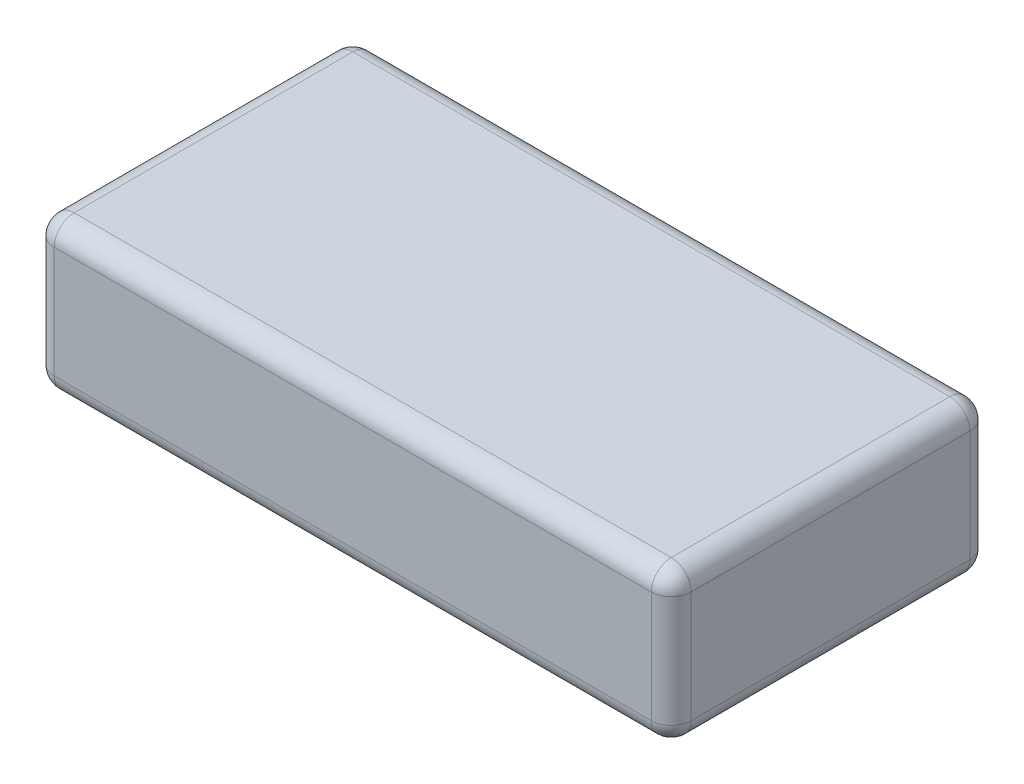
ISO-10303-21;
HEADER;
FILE_DESCRIPTION(('STEP AP214'),'2;1');
FILE_NAME('part.step','',(''),(''),'','','');
FILE_SCHEMA(('AUTOMOTIVE_DESIGN { 1 0 10303 214 1 1 1 1 }'));
ENDSEC;
DATA;
#1=APPLICATION_CONTEXT('core data for automotive mechanical design processes');
#2=APPLICATION_PROTOCOL_DEFINITION('international standard','automotive_design',2000,#1);
#3=PRODUCT_CONTEXT('',#1,'mechanical');
#4=PRODUCT('Part','Part','',(#3));
#5=PRODUCT_RELATED_PRODUCT_CATEGORY('part','',(#4));
#6=PRODUCT_DEFINITION_FORMATION('','',#4);
#7=PRODUCT_DEFINITION_CONTEXT('part definition',#1,'design');
#8=PRODUCT_DEFINITION('design','',#6,#7);
#9=PRODUCT_DEFINITION_SHAPE('','',#8);
#10=(LENGTH_UNIT() NAMED_UNIT(*) SI_UNIT(.MILLI.,.METRE.));
#11=(NAMED_UNIT(*) PLANE_ANGLE_UNIT() SI_UNIT($,.RADIAN.));
#12=(NAMED_UNIT(*) SI_UNIT($,.STERADIAN.) SOLID_ANGLE_UNIT());
#13=UNCERTAINTY_MEASURE_WITH_UNIT(LENGTH_MEASURE(1.E-05),#10,'distance_accuracy_value','');
#14=(GEOMETRIC_REPRESENTATION_CONTEXT(3) GLOBAL_UNCERTAINTY_ASSIGNED_CONTEXT((#13)) GLOBAL_UNIT_ASSIGNED_CONTEXT((#10,
#11,#12)) REPRESENTATION_CONTEXT('',''));
#15=CARTESIAN_POINT('',(0.,0.,0.));
#16=DIRECTION('',(0.,0.,1.));
#17=DIRECTION('',(1.,0.,0.));
#18=AXIS2_PLACEMENT_3D('',#15,#16,#17);
#19=CARTESIAN_POINT('',(0.75,0.05,-0.35));
#20=DIRECTION('',(1.,0.,0.));
#21=DIRECTION('',(0.,0.,1.));
#22=AXIS2_PLACEMENT_3D('',#19,#20,#21);
#23=SPHERICAL_SURFACE('',#22,0.05);
#24=CARTESIAN_POINT('',(0.75,0.05,-0.35));
#25=DIRECTION('',(1.,0.,0.));
#26=DIRECTION('',(0.,0.,-1.));
#27=AXIS2_PLACEMENT_3D('',#24,#25,#26);
#28=CIRCLE('',#27,0.05);
#29=CARTESIAN_POINT('',(0.75,0.,-0.35));
#30=VERTEX_POINT('',#29);
#31=CARTESIAN_POINT('',(0.75,0.050000000000024,-0.4));
#32=VERTEX_POINT('',#31);
#33=EDGE_CURVE('E153',#30,#32,#28,.T.);
#34=ORIENTED_EDGE('',*,*,#33,.T.);
#35=CARTESIAN_POINT('',(0.75,0.05,-0.35));
#36=DIRECTION('',(0.,1.,0.));
#37=DIRECTION('',(0.,0.,1.));
#38=AXIS2_PLACEMENT_3D('',#35,#36,#37);
#39=CIRCLE('',#38,0.05);
#40=CARTESIAN_POINT('',(0.8,0.05,-0.35));
#41=VERTEX_POINT('',#40);
#42=EDGE_CURVE('E155',#32,#41,#39,.F.);
#43=ORIENTED_EDGE('',*,*,#42,.T.);
#44=CARTESIAN_POINT('',(0.75,0.05,-0.35));
#45=DIRECTION('',(0.,0.,1.));
#46=DIRECTION('',(1.,0.,0.));
#47=AXIS2_PLACEMENT_3D('',#44,#45,#46);
#48=CIRCLE('',#47,0.05);
#49=EDGE_CURVE('E145',#41,#30,#48,.F.);
#50=ORIENTED_EDGE('',*,*,#49,.T.);
#51=EDGE_LOOP('',(#34,#43,#50));
#52=FACE_BOUND('',#51,.T.);
#53=ADVANCED_FACE('F37',(#52),#23,.T.);
#54=CARTESIAN_POINT('',(-0.75,0.05,-0.35));
#55=DIRECTION('',(1.,0.,0.));
#56=DIRECTION('',(0.,0.,1.));
#57=AXIS2_PLACEMENT_3D('',#54,#55,#56);
#58=SPHERICAL_SURFACE('',#57,0.05);
#59=CARTESIAN_POINT('',(-0.75,0.05,-0.35));
#60=DIRECTION('',(0.,1.,0.));
#61=DIRECTION('',(0.,0.,1.));
#62=AXIS2_PLACEMENT_3D('',#59,#60,#61);
#63=CIRCLE('',#62,0.05);
#64=CARTESIAN_POINT('',(-0.8,0.05,-0.35));
#65=VERTEX_POINT('',#64);
#66=CARTESIAN_POINT('',(-0.75,0.05,-0.4));
#67=VERTEX_POINT('',#66);
#68=EDGE_CURVE('E191',#65,#67,#63,.F.);
#69=ORIENTED_EDGE('',*,*,#68,.T.);
#70=CARTESIAN_POINT('',(-0.75,0.05,-0.35));
#71=DIRECTION('',(1.,0.,0.));
#72=DIRECTION('',(0.,0.,-1.));
#73=AXIS2_PLACEMENT_3D('',#70,#71,#72);
#74=CIRCLE('',#73,0.05);
#75=CARTESIAN_POINT('',(-0.75,0.,-0.35));
#76=VERTEX_POINT('',#75);
#77=EDGE_CURVE('E161',#67,#76,#74,.F.);
#78=ORIENTED_EDGE('',*,*,#77,.T.);
#79=CARTESIAN_POINT('',(-0.75,0.05,-0.35));
#80=DIRECTION('',(0.,0.,-1.));
#81=DIRECTION('',(-1.,0.,0.));
#82=AXIS2_PLACEMENT_3D('',#79,#80,#81);
#83=CIRCLE('',#82,0.05);
#84=EDGE_CURVE('E192',#76,#65,#83,.T.);
#85=ORIENTED_EDGE('',*,*,#84,.T.);
#86=EDGE_LOOP('',(#69,#78,#85));
#87=FACE_BOUND('',#86,.T.);
#88=ADVANCED_FACE('F178',(#87),#58,.T.);
#89=CARTESIAN_POINT('',(-0.75,0.05,0.35));
#90=DIRECTION('',(1.,0.,0.));
#91=DIRECTION('',(0.,0.,1.));
#92=AXIS2_PLACEMENT_3D('',#89,#90,#91);
#93=SPHERICAL_SURFACE('',#92,0.05);
#94=CARTESIAN_POINT('',(-0.75,0.05,0.35));
#95=DIRECTION('',(0.,1.,0.));
#96=DIRECTION('',(0.,0.,1.));
#97=AXIS2_PLACEMENT_3D('',#94,#95,#96);
#98=CIRCLE('',#97,0.05);
#99=CARTESIAN_POINT('',(-0.75,0.05,0.4));
#100=VERTEX_POINT('',#99);
#101=CARTESIAN_POINT('',(-0.8,0.05,0.35));
#102=VERTEX_POINT('',#101);
#103=EDGE_CURVE('E199',#100,#102,#98,.F.);
#104=ORIENTED_EDGE('',*,*,#103,.T.);
#105=CARTESIAN_POINT('',(-0.75,0.05,0.35));
#106=DIRECTION('',(0.,0.,-1.));
#107=DIRECTION('',(-1.,0.,0.));
#108=AXIS2_PLACEMENT_3D('',#105,#106,#107);
#109=CIRCLE('',#108,0.05);
#110=CARTESIAN_POINT('',(-0.75,0.,0.35));
#111=VERTEX_POINT('',#110);
#112=EDGE_CURVE('E201',#102,#111,#109,.F.);
#113=ORIENTED_EDGE('',*,*,#112,.T.);
#114=CARTESIAN_POINT('',(-0.75,0.05,0.35));
#115=DIRECTION('',(-1.,0.,0.));
#116=DIRECTION('',(0.,0.,1.));
#117=AXIS2_PLACEMENT_3D('',#114,#115,#116);
#118=CIRCLE('',#117,0.05);
#119=EDGE_CURVE('E210',#111,#100,#118,.T.);
#120=ORIENTED_EDGE('',*,*,#119,.T.);
#121=EDGE_LOOP('',(#104,#113,#120));
#122=FACE_BOUND('',#121,.T.);
#123=ADVANCED_FACE('F174',(#122),#93,.T.);
#124=CARTESIAN_POINT('',(0.75,0.05,0.35));
#125=DIRECTION('',(1.,0.,0.));
#126=DIRECTION('',(0.,0.,1.));
#127=AXIS2_PLACEMENT_3D('',#124,#125,#126);
#128=SPHERICAL_SURFACE('',#127,0.05);
#129=CARTESIAN_POINT('',(0.75,0.05,0.35));
#130=DIRECTION('',(-1.,0.,0.));
#131=DIRECTION('',(0.,0.,1.));
#132=AXIS2_PLACEMENT_3D('',#129,#130,#131);
#133=CIRCLE('',#132,0.05);
#134=CARTESIAN_POINT('',(0.75,0.05,0.4));
#135=VERTEX_POINT('',#134);
#136=CARTESIAN_POINT('',(0.75,0.,0.35));
#137=VERTEX_POINT('',#136);
#138=EDGE_CURVE('E220',#135,#137,#133,.F.);
#139=ORIENTED_EDGE('',*,*,#138,.T.);
#140=CARTESIAN_POINT('',(0.75,0.05,0.35));
#141=DIRECTION('',(0.,0.,1.));
#142=DIRECTION('',(1.,0.,0.));
#143=AXIS2_PLACEMENT_3D('',#140,#141,#142);
#144=CIRCLE('',#143,0.05);
#145=CARTESIAN_POINT('',(0.8,0.05,0.35));
#146=VERTEX_POINT('',#145);
#147=EDGE_CURVE('E148',#137,#146,#144,.T.);
#148=ORIENTED_EDGE('',*,*,#147,.T.);
#149=CARTESIAN_POINT('',(0.75,0.05,0.35));
#150=DIRECTION('',(0.,1.,0.));
#151=DIRECTION('',(0.,0.,1.));
#152=AXIS2_PLACEMENT_3D('',#149,#150,#151);
#153=CIRCLE('',#152,0.05);
#154=EDGE_CURVE('E196',#146,#135,#153,.F.);
#155=ORIENTED_EDGE('',*,*,#154,.T.);
#156=EDGE_LOOP('',(#139,#148,#155));
#157=FACE_BOUND('',#156,.T.);
#158=ADVANCED_FACE('F170',(#157),#128,.T.);
#159=CARTESIAN_POINT('',(0.75,0.05,-0.4));
#160=DIRECTION('',(0.,0.,-1.));
#161=DIRECTION('',(1.,0.,0.));
#162=AXIS2_PLACEMENT_3D('',#159,#160,#161);
#163=CYLINDRICAL_SURFACE('',#162,0.05);
#164=ORIENTED_EDGE('',*,*,#147,.F.);
#165=DIRECTION('',(0.,0.,-1.));
#166=VECTOR('',#165,1.);
#167=CARTESIAN_POINT('',(0.75,0.,-0.4));
#168=LINE('',#167,#166);
#169=EDGE_CURVE('E129',#30,#137,#168,.F.);
#170=ORIENTED_EDGE('',*,*,#169,.F.);
#171=ORIENTED_EDGE('',*,*,#49,.F.);
#172=DIRECTION('',(0.,0.,-1.));
#173=VECTOR('',#172,1.);
#174=CARTESIAN_POINT('',(0.8,0.05,-0.4));
#175=LINE('',#174,#173);
#176=EDGE_CURVE('E222',#146,#41,#175,.T.);
#177=ORIENTED_EDGE('',*,*,#176,.F.);
#178=EDGE_LOOP('',(#164,#170,#171,#177));
#179=FACE_BOUND('',#178,.T.);
#180=ADVANCED_FACE('F143',(#179),#163,.T.);
#181=CARTESIAN_POINT('',(0.75,0.38,-0.35));
#182=DIRECTION('',(0.,-1.,0.));
#183=DIRECTION('',(0.,0.,1.));
#184=AXIS2_PLACEMENT_3D('',#181,#182,#183);
#185=CYLINDRICAL_SURFACE('',#184,0.05);
#186=ORIENTED_EDGE('',*,*,#42,.F.);
#187=DIRECTION('',(0.,1.,0.));
#188=VECTOR('',#187,1.);
#189=CARTESIAN_POINT('',(0.75,0.38,-0.4));
#190=LINE('',#189,#188);
#191=CARTESIAN_POINT('',(0.75,0.33,-0.4));
#192=VERTEX_POINT('',#191);
#193=EDGE_CURVE('E137',#192,#32,#190,.F.);
#194=ORIENTED_EDGE('',*,*,#193,.F.);
#195=CARTESIAN_POINT('',(0.75,0.33,-0.35));
#196=DIRECTION('',(0.,1.,0.));
#197=DIRECTION('',(1.,0.,0.));
#198=AXIS2_PLACEMENT_3D('',#195,#196,#197);
#199=CIRCLE('',#198,0.05);
#200=CARTESIAN_POINT('',(0.8,0.33,-0.35));
#201=VERTEX_POINT('',#200);
#202=EDGE_CURVE('E232',#192,#201,#199,.F.);
#203=ORIENTED_EDGE('',*,*,#202,.T.);
#204=DIRECTION('',(0.,1.,0.));
#205=VECTOR('',#204,1.);
#206=CARTESIAN_POINT('',(0.8,0.38,-0.35));
#207=LINE('',#206,#205);
#208=EDGE_CURVE('E227',#41,#201,#207,.T.);
#209=ORIENTED_EDGE('',*,*,#208,.F.);
#210=EDGE_LOOP('',(#186,#194,#203,#209));
#211=FACE_BOUND('',#210,.T.);
#212=ADVANCED_FACE('F268',(#211),#185,.T.);
#213=CARTESIAN_POINT('',(-0.75,0.05,-0.4));
#214=DIRECTION('',(0.,0.,1.));
#215=DIRECTION('',(-1.,0.,0.));
#216=AXIS2_PLACEMENT_3D('',#213,#214,#215);
#217=CYLINDRICAL_SURFACE('',#216,0.05);
#218=ORIENTED_EDGE('',*,*,#112,.F.);
#219=DIRECTION('',(0.,0.,1.));
#220=VECTOR('',#219,1.);
#221=CARTESIAN_POINT('',(-0.8,0.05,-0.4));
#222=LINE('',#221,#220);
#223=EDGE_CURVE('E216',#65,#102,#222,.T.);
#224=ORIENTED_EDGE('',*,*,#223,.F.);
#225=ORIENTED_EDGE('',*,*,#84,.F.);
#226=DIRECTION('',(0.,0.,1.));
#227=VECTOR('',#226,1.);
#228=CARTESIAN_POINT('',(-0.75,0.,-0.4));
#229=LINE('',#228,#227);
#230=EDGE_CURVE('E132',#111,#76,#229,.F.);
#231=ORIENTED_EDGE('',*,*,#230,.F.);
#232=EDGE_LOOP('',(#218,#224,#225,#231));
#233=FACE_BOUND('',#232,.T.);
#234=ADVANCED_FACE('F214',(#233),#217,.T.);
#235=CARTESIAN_POINT('',(-0.75,0.38,-0.35));
#236=DIRECTION('',(0.,-1.,0.));
#237=DIRECTION('',(0.,0.,1.));
#238=AXIS2_PLACEMENT_3D('',#235,#236,#237);
#239=CYLINDRICAL_SURFACE('',#238,0.05);
#240=ORIENTED_EDGE('',*,*,#68,.F.);
#241=DIRECTION('',(0.,1.,0.));
#242=VECTOR('',#241,1.);
#243=CARTESIAN_POINT('',(-0.8,0.38,-0.35));
#244=LINE('',#243,#242);
#245=CARTESIAN_POINT('',(-0.8,0.33,-0.35));
#246=VERTEX_POINT('',#245);
#247=EDGE_CURVE('E311',#246,#65,#244,.F.);
#248=ORIENTED_EDGE('',*,*,#247,.F.);
#249=CARTESIAN_POINT('',(-0.75,0.33,-0.35));
#250=DIRECTION('',(0.,1.,0.));
#251=DIRECTION('',(1.,0.,0.));
#252=AXIS2_PLACEMENT_3D('',#249,#250,#251);
#253=CIRCLE('',#252,0.05);
#254=CARTESIAN_POINT('',(-0.75,0.33,-0.4));
#255=VERTEX_POINT('',#254);
#256=EDGE_CURVE('E316',#246,#255,#253,.F.);
#257=ORIENTED_EDGE('',*,*,#256,.T.);
#258=DIRECTION('',(0.,1.,0.));
#259=VECTOR('',#258,1.);
#260=CARTESIAN_POINT('',(-0.75,0.38,-0.4));
#261=LINE('',#260,#259);
#262=EDGE_CURVE('E235',#67,#255,#261,.T.);
#263=ORIENTED_EDGE('',*,*,#262,.F.);
#264=EDGE_LOOP('',(#240,#248,#257,#263));
#265=FACE_BOUND('',#264,.T.);
#266=ADVANCED_FACE('F263',(#265),#239,.T.);
#267=CARTESIAN_POINT('',(0.75,0.38,0.35));
#268=DIRECTION('',(0.,-1.,0.));
#269=DIRECTION('',(0.,0.,1.));
#270=AXIS2_PLACEMENT_3D('',#267,#268,#269);
#271=CYLINDRICAL_SURFACE('',#270,0.05);
#272=ORIENTED_EDGE('',*,*,#154,.F.);
#273=DIRECTION('',(0.,1.,0.));
#274=VECTOR('',#273,1.);
#275=CARTESIAN_POINT('',(0.8,0.38,0.35));
#276=LINE('',#275,#274);
#277=CARTESIAN_POINT('',(0.8,0.33,0.35));
#278=VERTEX_POINT('',#277);
#279=EDGE_CURVE('E138',#278,#146,#276,.F.);
#280=ORIENTED_EDGE('',*,*,#279,.F.);
#281=CARTESIAN_POINT('',(0.75,0.33,0.35));
#282=DIRECTION('',(0.,-1.,0.));
#283=DIRECTION('',(1.,0.,0.));
#284=AXIS2_PLACEMENT_3D('',#281,#282,#283);
#285=CIRCLE('',#284,0.05);
#286=CARTESIAN_POINT('',(0.75,0.33,0.4));
#287=VERTEX_POINT('',#286);
#288=EDGE_CURVE('E285',#278,#287,#285,.T.);
#289=ORIENTED_EDGE('',*,*,#288,.T.);
#290=DIRECTION('',(0.,1.,0.));
#291=VECTOR('',#290,1.);
#292=CARTESIAN_POINT('',(0.75,0.38,0.4));
#293=LINE('',#292,#291);
#294=EDGE_CURVE('E283',#135,#287,#293,.T.);
#295=ORIENTED_EDGE('',*,*,#294,.F.);
#296=EDGE_LOOP('',(#272,#280,#289,#295));
#297=FACE_BOUND('',#296,.T.);
#298=ADVANCED_FACE('F259',(#297),#271,.T.);
#299=CARTESIAN_POINT('',(-0.75,0.38,0.35));
#300=DIRECTION('',(0.,-1.,0.));
#301=DIRECTION('',(0.,0.,1.));
#302=AXIS2_PLACEMENT_3D('',#299,#300,#301);
#303=CYLINDRICAL_SURFACE('',#302,0.05);
#304=CARTESIAN_POINT('',(-0.75,0.33,0.35));
#305=DIRECTION('',(0.,-1.,0.));
#306=DIRECTION('',(1.,0.,0.));
#307=AXIS2_PLACEMENT_3D('',#304,#305,#306);
#308=CIRCLE('',#307,0.05);
#309=CARTESIAN_POINT('',(-0.75,0.33,0.4));
#310=VERTEX_POINT('',#309);
#311=CARTESIAN_POINT('',(-0.8,0.33,0.35));
#312=VERTEX_POINT('',#311);
#313=EDGE_CURVE('E290',#310,#312,#308,.T.);
#314=ORIENTED_EDGE('',*,*,#313,.T.);
#315=DIRECTION('',(0.,1.,0.));
#316=VECTOR('',#315,1.);
#317=CARTESIAN_POINT('',(-0.8,0.38,0.35));
#318=LINE('',#317,#316);
#319=EDGE_CURVE('E313',#102,#312,#318,.T.);
#320=ORIENTED_EDGE('',*,*,#319,.F.);
#321=ORIENTED_EDGE('',*,*,#103,.F.);
#322=DIRECTION('',(0.,1.,0.));
#323=VECTOR('',#322,1.);
#324=CARTESIAN_POINT('',(-0.75,0.38,0.4));
#325=LINE('',#324,#323);
#326=EDGE_CURVE('E287',#310,#100,#325,.F.);
#327=ORIENTED_EDGE('',*,*,#326,.F.);
#328=EDGE_LOOP('',(#314,#320,#321,#327));
#329=FACE_BOUND('',#328,.T.);
#330=ADVANCED_FACE('F256',(#329),#303,.T.);
#331=CARTESIAN_POINT('',(0.8,0.,0.4));
#332=DIRECTION('',(0.,-1.,0.));
#333=DIRECTION('',(0.,0.,1.));
#334=AXIS2_PLACEMENT_3D('',#331,#332,#333);
#335=PLANE('',#334);
#336=DIRECTION('',(1.,0.,0.));
#337=VECTOR('',#336,1.);
#338=CARTESIAN_POINT('',(-0.8,0.,0.35));
#339=LINE('',#338,#337);
#340=EDGE_CURVE('E121',#137,#111,#339,.F.);
#341=ORIENTED_EDGE('',*,*,#340,.T.);
#342=ORIENTED_EDGE('',*,*,#230,.T.);
#343=DIRECTION('',(-1.,0.,0.));
#344=VECTOR('',#343,1.);
#345=CARTESIAN_POINT('',(-0.8,0.,-0.35));
#346=LINE('',#345,#344);
#347=EDGE_CURVE('E126',#76,#30,#346,.F.);
#348=ORIENTED_EDGE('',*,*,#347,.T.);
#349=ORIENTED_EDGE('',*,*,#169,.T.);
#350=EDGE_LOOP('',(#341,#342,#348,#349));
#351=FACE_BOUND('',#350,.T.);
#352=ADVANCED_FACE('F128',(#351),#335,.T.);
#353=CARTESIAN_POINT('',(0.8,0.38,-0.4));
#354=DIRECTION('',(-1.,0.,0.));
#355=DIRECTION('',(0.,0.,-1.));
#356=AXIS2_PLACEMENT_3D('',#353,#354,#355);
#357=PLANE('',#356);
#358=DIRECTION('',(0.,0.,1.));
#359=VECTOR('',#358,1.);
#360=CARTESIAN_POINT('',(0.8,0.33,0.4));
#361=LINE('',#360,#359);
#362=EDGE_CURVE('E332',#201,#278,#361,.T.);
#363=ORIENTED_EDGE('',*,*,#362,.T.);
#364=ORIENTED_EDGE('',*,*,#279,.T.);
#365=ORIENTED_EDGE('',*,*,#176,.T.);
#366=ORIENTED_EDGE('',*,*,#208,.T.);
#367=EDGE_LOOP('',(#363,#364,#365,#366));
#368=FACE_BOUND('',#367,.T.);
#369=ADVANCED_FACE('F250',(#368),#357,.F.);
#370=CARTESIAN_POINT('',(-0.8,0.05,-0.35));
#371=DIRECTION('',(-1.,0.,0.));
#372=DIRECTION('',(0.,0.,-1.));
#373=AXIS2_PLACEMENT_3D('',#370,#371,#372);
#374=CYLINDRICAL_SURFACE('',#373,0.05);
#375=ORIENTED_EDGE('',*,*,#347,.F.);
#376=ORIENTED_EDGE('',*,*,#77,.F.);
#377=DIRECTION('',(-1.,0.,0.));
#378=VECTOR('',#377,1.);
#379=CARTESIAN_POINT('',(-0.8,0.05,-0.4));
#380=LINE('',#379,#378);
#381=EDGE_CURVE('E158',#32,#67,#380,.T.);
#382=ORIENTED_EDGE('',*,*,#381,.F.);
#383=ORIENTED_EDGE('',*,*,#33,.F.);
#384=EDGE_LOOP('',(#375,#376,#382,#383));
#385=FACE_BOUND('',#384,.T.);
#386=ADVANCED_FACE('F157',(#385),#374,.T.);
#387=CARTESIAN_POINT('',(0.75,0.33,-0.35));
#388=DIRECTION('',(1.,0.,0.));
#389=DIRECTION('',(0.,0.,1.));
#390=AXIS2_PLACEMENT_3D('',#387,#388,#389);
#391=SPHERICAL_SURFACE('',#390,0.05);
#392=ORIENTED_EDGE('',*,*,#202,.F.);
#393=CARTESIAN_POINT('',(0.75,0.33,-0.35));
#394=DIRECTION('',(-1.,0.,0.));
#395=DIRECTION('',(0.,0.,1.));
#396=AXIS2_PLACEMENT_3D('',#393,#394,#395);
#397=CIRCLE('',#396,0.05);
#398=CARTESIAN_POINT('',(0.75,0.38,-0.35));
#399=VERTEX_POINT('',#398);
#400=EDGE_CURVE('E325',#192,#399,#397,.F.);
#401=ORIENTED_EDGE('',*,*,#400,.T.);
#402=CARTESIAN_POINT('',(0.75,0.33,-0.35));
#403=DIRECTION('',(0.,0.,-1.));
#404=DIRECTION('',(-1.,0.,0.));
#405=AXIS2_PLACEMENT_3D('',#402,#403,#404);
#406=CIRCLE('',#405,0.05);
#407=EDGE_CURVE('E337',#399,#201,#406,.T.);
#408=ORIENTED_EDGE('',*,*,#407,.T.);
#409=EDGE_LOOP('',(#392,#401,#408));
#410=FACE_BOUND('',#409,.T.);
#411=ADVANCED_FACE('F240',(#410),#391,.T.);
#412=CARTESIAN_POINT('',(-0.75,0.33,-0.35));
#413=DIRECTION('',(1.,0.,0.));
#414=DIRECTION('',(0.,0.,1.));
#415=AXIS2_PLACEMENT_3D('',#412,#413,#414);
#416=SPHERICAL_SURFACE('',#415,0.05);
#417=ORIENTED_EDGE('',*,*,#256,.F.);
#418=CARTESIAN_POINT('',(-0.75,0.33,-0.35));
#419=DIRECTION('',(0.,0.,1.));
#420=DIRECTION('',(1.,0.,0.));
#421=AXIS2_PLACEMENT_3D('',#418,#419,#420);
#422=CIRCLE('',#421,0.05);
#423=CARTESIAN_POINT('',(-0.75,0.38,-0.35));
#424=VERTEX_POINT('',#423);
#425=EDGE_CURVE('E357',#246,#424,#422,.F.);
#426=ORIENTED_EDGE('',*,*,#425,.T.);
#427=CARTESIAN_POINT('',(-0.75,0.33,-0.35));
#428=DIRECTION('',(-1.,0.,0.));
#429=DIRECTION('',(0.,0.,1.));
#430=AXIS2_PLACEMENT_3D('',#427,#428,#429);
#431=CIRCLE('',#430,0.05);
#432=EDGE_CURVE('E329',#424,#255,#431,.T.);
#433=ORIENTED_EDGE('',*,*,#432,.T.);
#434=EDGE_LOOP('',(#417,#426,#433));
#435=FACE_BOUND('',#434,.T.);
#436=ADVANCED_FACE('F244',(#435),#416,.T.);
#437=CARTESIAN_POINT('',(-0.8,0.38,-0.4));
#438=DIRECTION('',(1.,0.,0.));
#439=DIRECTION('',(0.,0.,1.));
#440=AXIS2_PLACEMENT_3D('',#437,#438,#439);
#441=PLANE('',#440);
#442=DIRECTION('',(0.,0.,-1.));
#443=VECTOR('',#442,1.);
#444=CARTESIAN_POINT('',(-0.8,0.33,0.4));
#445=LINE('',#444,#443);
#446=EDGE_CURVE('E350',#312,#246,#445,.T.);
#447=ORIENTED_EDGE('',*,*,#446,.T.);
#448=ORIENTED_EDGE('',*,*,#247,.T.);
#449=ORIENTED_EDGE('',*,*,#223,.T.);
#450=ORIENTED_EDGE('',*,*,#319,.T.);
#451=EDGE_LOOP('',(#447,#448,#449,#450));
#452=FACE_BOUND('',#451,.T.);
#453=ADVANCED_FACE('F305',(#452),#441,.F.);
#454=CARTESIAN_POINT('',(-0.75,0.33,0.35));
#455=DIRECTION('',(1.,0.,0.));
#456=DIRECTION('',(0.,0.,1.));
#457=AXIS2_PLACEMENT_3D('',#454,#455,#456);
#458=SPHERICAL_SURFACE('',#457,0.05);
#459=CARTESIAN_POINT('',(-0.75,0.33,0.35));
#460=DIRECTION('',(0.,0.,1.));
#461=DIRECTION('',(1.,0.,0.));
#462=AXIS2_PLACEMENT_3D('',#459,#460,#461);
#463=CIRCLE('',#462,0.05);
#464=CARTESIAN_POINT('',(-0.75,0.38,0.350000000000096));
#465=VERTEX_POINT('',#464);
#466=EDGE_CURVE('E355',#465,#312,#463,.T.);
#467=ORIENTED_EDGE('',*,*,#466,.T.);
#468=ORIENTED_EDGE('',*,*,#313,.F.);
#469=CARTESIAN_POINT('',(-0.75,0.33,0.35));
#470=DIRECTION('',(1.,0.,0.));
#471=DIRECTION('',(0.,0.,-1.));
#472=AXIS2_PLACEMENT_3D('',#469,#470,#471);
#473=CIRCLE('',#472,0.05);
#474=EDGE_CURVE('E345',#310,#465,#473,.F.);
#475=ORIENTED_EDGE('',*,*,#474,.T.);
#476=EDGE_LOOP('',(#467,#468,#475));
#477=FACE_BOUND('',#476,.T.);
#478=ADVANCED_FACE('F301',(#477),#458,.T.);
#479=CARTESIAN_POINT('',(0.75,0.33,0.35));
#480=DIRECTION('',(1.,0.,0.));
#481=DIRECTION('',(0.,0.,1.));
#482=AXIS2_PLACEMENT_3D('',#479,#480,#481);
#483=SPHERICAL_SURFACE('',#482,0.05);
#484=CARTESIAN_POINT('',(0.75,0.33,0.35));
#485=DIRECTION('',(0.,0.,-1.));
#486=DIRECTION('',(-1.,0.,0.));
#487=AXIS2_PLACEMENT_3D('',#484,#485,#486);
#488=CIRCLE('',#487,0.05);
#489=CARTESIAN_POINT('',(0.75,0.38,0.35));
#490=VERTEX_POINT('',#489);
#491=EDGE_CURVE('E326',#278,#490,#488,.F.);
#492=ORIENTED_EDGE('',*,*,#491,.T.);
#493=CARTESIAN_POINT('',(0.75,0.33,0.35));
#494=DIRECTION('',(1.,0.,0.));
#495=DIRECTION('',(0.,0.,-1.));
#496=AXIS2_PLACEMENT_3D('',#493,#494,#495);
#497=CIRCLE('',#496,0.05);
#498=EDGE_CURVE('E344',#490,#287,#497,.T.);
#499=ORIENTED_EDGE('',*,*,#498,.T.);
#500=ORIENTED_EDGE('',*,*,#288,.F.);
#501=EDGE_LOOP('',(#492,#499,#500));
#502=FACE_BOUND('',#501,.T.);
#503=ADVANCED_FACE('F297',(#502),#483,.T.);
#504=CARTESIAN_POINT('',(-0.8,0.05,0.35));
#505=DIRECTION('',(1.,0.,0.));
#506=DIRECTION('',(0.,0.,1.));
#507=AXIS2_PLACEMENT_3D('',#504,#505,#506);
#508=CYLINDRICAL_SURFACE('',#507,0.05);
#509=DIRECTION('',(1.,0.,0.));
#510=VECTOR('',#509,1.);
#511=CARTESIAN_POINT('',(-0.8,0.05,0.4));
#512=LINE('',#511,#510);
#513=EDGE_CURVE('E218',#100,#135,#512,.T.);
#514=ORIENTED_EDGE('',*,*,#513,.F.);
#515=ORIENTED_EDGE('',*,*,#119,.F.);
#516=ORIENTED_EDGE('',*,*,#340,.F.);
#517=ORIENTED_EDGE('',*,*,#138,.F.);
#518=EDGE_LOOP('',(#514,#515,#516,#517));
#519=FACE_BOUND('',#518,.T.);
#520=ADVANCED_FACE('F217',(#519),#508,.T.);
#521=CARTESIAN_POINT('',(0.75,0.33,0.4));
#522=DIRECTION('',(0.,0.,1.));
#523=DIRECTION('',(-1.,0.,0.));
#524=AXIS2_PLACEMENT_3D('',#521,#522,#523);
#525=CYLINDRICAL_SURFACE('',#524,0.05);
#526=ORIENTED_EDGE('',*,*,#491,.F.);
#527=ORIENTED_EDGE('',*,*,#362,.F.);
#528=ORIENTED_EDGE('',*,*,#407,.F.);
#529=DIRECTION('',(0.,0.,1.));
#530=VECTOR('',#529,1.);
#531=CARTESIAN_POINT('',(0.75,0.38,0.4));
#532=LINE('',#531,#530);
#533=EDGE_CURVE('E347',#490,#399,#532,.F.);
#534=ORIENTED_EDGE('',*,*,#533,.F.);
#535=EDGE_LOOP('',(#526,#527,#528,#534));
#536=FACE_BOUND('',#535,.T.);
#537=ADVANCED_FACE('F342',(#536),#525,.T.);
#538=CARTESIAN_POINT('',(-0.8,0.38,-0.4));
#539=DIRECTION('',(0.,0.,1.));
#540=DIRECTION('',(-1.,0.,0.));
#541=AXIS2_PLACEMENT_3D('',#538,#539,#540);
#542=PLANE('',#541);
#543=DIRECTION('',(1.,0.,0.));
#544=VECTOR('',#543,1.);
#545=CARTESIAN_POINT('',(0.8,0.33,-0.4));
#546=LINE('',#545,#544);
#547=EDGE_CURVE('E323',#255,#192,#546,.T.);
#548=ORIENTED_EDGE('',*,*,#547,.T.);
#549=ORIENTED_EDGE('',*,*,#193,.T.);
#550=ORIENTED_EDGE('',*,*,#381,.T.);
#551=ORIENTED_EDGE('',*,*,#262,.T.);
#552=EDGE_LOOP('',(#548,#549,#550,#551));
#553=FACE_BOUND('',#552,.T.);
#554=ADVANCED_FACE('F322',(#553),#542,.F.);
#555=CARTESIAN_POINT('',(-0.75,0.33,0.4));
#556=DIRECTION('',(0.,0.,-1.));
#557=DIRECTION('',(1.,0.,0.));
#558=AXIS2_PLACEMENT_3D('',#555,#556,#557);
#559=CYLINDRICAL_SURFACE('',#558,0.05);
#560=ORIENTED_EDGE('',*,*,#466,.F.);
#561=DIRECTION('',(0.,0.,1.));
#562=VECTOR('',#561,1.);
#563=CARTESIAN_POINT('',(-0.75,0.38,0.4));
#564=LINE('',#563,#562);
#565=EDGE_CURVE('E366',#424,#465,#564,.T.);
#566=ORIENTED_EDGE('',*,*,#565,.F.);
#567=ORIENTED_EDGE('',*,*,#425,.F.);
#568=ORIENTED_EDGE('',*,*,#446,.F.);
#569=EDGE_LOOP('',(#560,#566,#567,#568));
#570=FACE_BOUND('',#569,.T.);
#571=ADVANCED_FACE('F377',(#570),#559,.T.);
#572=CARTESIAN_POINT('',(-0.8,0.38,0.4));
#573=DIRECTION('',(0.,0.,-1.));
#574=DIRECTION('',(1.,0.,0.));
#575=AXIS2_PLACEMENT_3D('',#572,#573,#574);
#576=PLANE('',#575);
#577=ORIENTED_EDGE('',*,*,#513,.T.);
#578=ORIENTED_EDGE('',*,*,#294,.T.);
#579=DIRECTION('',(-1.,0.,0.));
#580=VECTOR('',#579,1.);
#581=CARTESIAN_POINT('',(0.8,0.33,0.4));
#582=LINE('',#581,#580);
#583=EDGE_CURVE('E368',#287,#310,#582,.T.);
#584=ORIENTED_EDGE('',*,*,#583,.T.);
#585=ORIENTED_EDGE('',*,*,#326,.T.);
#586=EDGE_LOOP('',(#577,#578,#584,#585));
#587=FACE_BOUND('',#586,.T.);
#588=ADVANCED_FACE('F382',(#587),#576,.F.);
#589=CARTESIAN_POINT('',(0.8,0.33,-0.35));
#590=DIRECTION('',(1.,0.,0.));
#591=DIRECTION('',(0.,0.,1.));
#592=AXIS2_PLACEMENT_3D('',#589,#590,#591);
#593=CYLINDRICAL_SURFACE('',#592,0.05);
#594=ORIENTED_EDGE('',*,*,#547,.F.);
#595=ORIENTED_EDGE('',*,*,#432,.F.);
#596=DIRECTION('',(1.,0.,0.));
#597=VECTOR('',#596,1.);
#598=CARTESIAN_POINT('',(0.8,0.38,-0.35));
#599=LINE('',#598,#597);
#600=EDGE_CURVE('E46',#399,#424,#599,.F.);
#601=ORIENTED_EDGE('',*,*,#600,.F.);
#602=ORIENTED_EDGE('',*,*,#400,.F.);
#603=EDGE_LOOP('',(#594,#595,#601,#602));
#604=FACE_BOUND('',#603,.T.);
#605=ADVANCED_FACE('F364',(#604),#593,.T.);
#606=CARTESIAN_POINT('',(0.8,0.33,0.35));
#607=DIRECTION('',(-1.,0.,0.));
#608=DIRECTION('',(0.,0.,-1.));
#609=AXIS2_PLACEMENT_3D('',#606,#607,#608);
#610=CYLINDRICAL_SURFACE('',#609,0.05);
#611=DIRECTION('',(1.,0.,0.));
#612=VECTOR('',#611,1.);
#613=CARTESIAN_POINT('',(0.8,0.38,0.35));
#614=LINE('',#613,#612);
#615=EDGE_CURVE('E11',#465,#490,#614,.T.);
#616=ORIENTED_EDGE('',*,*,#615,.F.);
#617=ORIENTED_EDGE('',*,*,#474,.F.);
#618=ORIENTED_EDGE('',*,*,#583,.F.);
#619=ORIENTED_EDGE('',*,*,#498,.F.);
#620=EDGE_LOOP('',(#616,#617,#618,#619));
#621=FACE_BOUND('',#620,.T.);
#622=ADVANCED_FACE('F381',(#621),#610,.T.);
#623=CARTESIAN_POINT('',(0.8,0.38,0.4));
#624=DIRECTION('',(0.,-1.,0.));
#625=DIRECTION('',(0.,0.,1.));
#626=AXIS2_PLACEMENT_3D('',#623,#624,#625);
#627=PLANE('',#626);
#628=ORIENTED_EDGE('',*,*,#615,.T.);
#629=ORIENTED_EDGE('',*,*,#533,.T.);
#630=ORIENTED_EDGE('',*,*,#600,.T.);
#631=ORIENTED_EDGE('',*,*,#565,.T.);
#632=EDGE_LOOP('',(#628,#629,#630,#631));
#633=FACE_BOUND('',#632,.T.);
#634=ADVANCED_FACE('F374',(#633),#627,.F.);
#635=CLOSED_SHELL('',(#53,#88,#123,#158,#180,#212,#234,#266,#298,#330,#352,#369,#386,#411,#436,
#453,#478,#503,#520,#537,#554,#571,#588,#605,#622,#634));
#636=MANIFOLD_SOLID_BREP('B2',#635);
#637=ADVANCED_BREP_SHAPE_REPRESENTATION('',(#18,#636),#14);
#638=SHAPE_DEFINITION_REPRESENTATION(#9,#637);
ENDSEC;
END-ISO-10303-21;
